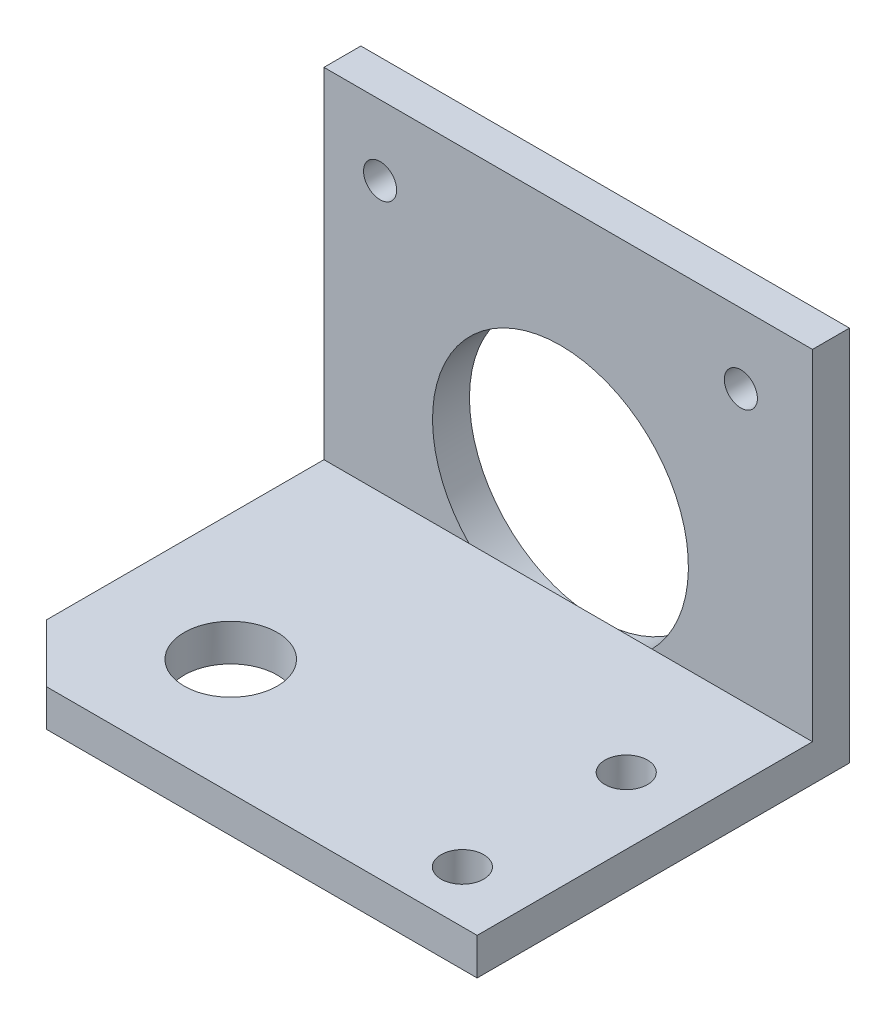
ISO-10303-21;
HEADER;
FILE_DESCRIPTION(('STEP AP214'),'2;1');
FILE_NAME('part.step','',(''),(''),'','','');
FILE_SCHEMA(('AUTOMOTIVE_DESIGN { 1 0 10303 214 1 1 1 1 }'));
ENDSEC;
DATA;
#1=APPLICATION_CONTEXT('core data for automotive mechanical design processes');
#2=APPLICATION_PROTOCOL_DEFINITION('international standard','automotive_design',2000,#1);
#3=PRODUCT_CONTEXT('',#1,'mechanical');
#4=PRODUCT('Part','Part','',(#3));
#5=PRODUCT_RELATED_PRODUCT_CATEGORY('part','',(#4));
#6=PRODUCT_DEFINITION_FORMATION('','',#4);
#7=PRODUCT_DEFINITION_CONTEXT('part definition',#1,'design');
#8=PRODUCT_DEFINITION('design','',#6,#7);
#9=PRODUCT_DEFINITION_SHAPE('','',#8);
#10=(LENGTH_UNIT() NAMED_UNIT(*) SI_UNIT(.MILLI.,.METRE.));
#11=(NAMED_UNIT(*) PLANE_ANGLE_UNIT() SI_UNIT($,.RADIAN.));
#12=(NAMED_UNIT(*) SI_UNIT($,.STERADIAN.) SOLID_ANGLE_UNIT());
#13=UNCERTAINTY_MEASURE_WITH_UNIT(LENGTH_MEASURE(1.E-05),#10,'distance_accuracy_value','');
#14=(GEOMETRIC_REPRESENTATION_CONTEXT(3) GLOBAL_UNCERTAINTY_ASSIGNED_CONTEXT((#13)) GLOBAL_UNIT_ASSIGNED_CONTEXT((#10,
#11,#12)) REPRESENTATION_CONTEXT('',''));
#15=CARTESIAN_POINT('',(0.,0.,0.));
#16=DIRECTION('',(0.,0.,1.));
#17=DIRECTION('',(1.,0.,0.));
#18=AXIS2_PLACEMENT_3D('',#15,#16,#17);
#19=CARTESIAN_POINT('',(21.,3.175,16.0020000000001));
#20=DIRECTION('',(-1.,0.,0.));
#21=DIRECTION('',(0.,0.,1.));
#22=AXIS2_PLACEMENT_3D('',#19,#20,#21);
#23=PLANE('',#22);
#24=DIRECTION('',(0.,0.,-1.));
#25=VECTOR('',#24,1.);
#26=CARTESIAN_POINT('',(21.,0.,16.0020000000001));
#27=LINE('',#26,#25);
#28=CARTESIAN_POINT('',(21.,0.,16.0020000000001));
#29=VERTEX_POINT('',#28);
#30=CARTESIAN_POINT('',(21.,0.,-16.0019999999999));
#31=VERTEX_POINT('',#30);
#32=EDGE_CURVE('E129',#29,#31,#27,.T.);
#33=ORIENTED_EDGE('',*,*,#32,.T.);
#34=DIRECTION('',(0.,-1.,0.));
#35=VECTOR('',#34,1.);
#36=CARTESIAN_POINT('',(21.,3.175,-16.0019999999999));
#37=LINE('',#36,#35);
#38=CARTESIAN_POINT('',(21.,32.385,-16.0019999999999));
#39=VERTEX_POINT('',#38);
#40=EDGE_CURVE('E144',#39,#31,#37,.T.);
#41=ORIENTED_EDGE('',*,*,#40,.F.);
#42=DIRECTION('',(0.,0.,-1.));
#43=VECTOR('',#42,1.);
#44=CARTESIAN_POINT('',(21.,32.385,-12.8269999999999));
#45=LINE('',#44,#43);
#46=CARTESIAN_POINT('',(21.,32.385,-12.8269999999999));
#47=VERTEX_POINT('',#46);
#48=EDGE_CURVE('E200',#47,#39,#45,.T.);
#49=ORIENTED_EDGE('',*,*,#48,.F.);
#50=DIRECTION('',(0.,-1.,0.));
#51=VECTOR('',#50,1.);
#52=CARTESIAN_POINT('',(21.,0.,-12.8269999999999));
#53=LINE('',#52,#51);
#54=CARTESIAN_POINT('',(21.,3.175,-12.8269999999999));
#55=VERTEX_POINT('',#54);
#56=EDGE_CURVE('E189',#47,#55,#53,.T.);
#57=ORIENTED_EDGE('',*,*,#56,.T.);
#58=DIRECTION('',(0.,0.,-1.));
#59=VECTOR('',#58,1.);
#60=CARTESIAN_POINT('',(21.,3.175,16.0020000000001));
#61=LINE('',#60,#59);
#62=CARTESIAN_POINT('',(21.,3.175,16.0020000000001));
#63=VERTEX_POINT('',#62);
#64=EDGE_CURVE('E130',#63,#55,#61,.T.);
#65=ORIENTED_EDGE('',*,*,#64,.F.);
#66=DIRECTION('',(0.,-1.,0.));
#67=VECTOR('',#66,1.);
#68=CARTESIAN_POINT('',(21.,3.175,16.0020000000001));
#69=LINE('',#68,#67);
#70=EDGE_CURVE('E139',#63,#29,#69,.T.);
#71=ORIENTED_EDGE('',*,*,#70,.T.);
#72=EDGE_LOOP('',(#33,#41,#49,#57,#65,#71));
#73=FACE_BOUND('',#72,.T.);
#74=ADVANCED_FACE('F32',(#73),#23,.F.);
#75=CARTESIAN_POINT('',(-20.9999999999999,3.175,-16.0019999999999));
#76=DIRECTION('',(0.,0.,1.));
#77=DIRECTION('',(1.,0.,0.));
#78=AXIS2_PLACEMENT_3D('',#75,#76,#77);
#79=PLANE('',#78);
#80=CARTESIAN_POINT('',(14.8407038267321,26.3651999999999,-16.0019999999999));
#81=DIRECTION('',(0.,0.,1.));
#82=DIRECTION('',(1.,0.,0.));
#83=AXIS2_PLACEMENT_3D('',#80,#81,#82);
#84=CIRCLE('',#83,1.4224);
#85=CARTESIAN_POINT('',(16.2631038267321,26.3651999999999,-16.0019999999999));
#86=VERTEX_POINT('',#85);
#87=EDGE_CURVE('E169',#86,#86,#84,.T.);
#88=ORIENTED_EDGE('',*,*,#87,.T.);
#89=EDGE_LOOP('',(#88));
#90=FACE_BOUND('',#89,.T.);
#91=CARTESIAN_POINT('',(-16.1726961732679,26.3652,-16.0019999999999));
#92=DIRECTION('',(0.,0.,1.));
#93=DIRECTION('',(1.,0.,0.));
#94=AXIS2_PLACEMENT_3D('',#91,#92,#93);
#95=CIRCLE('',#94,1.42239999999999);
#96=CARTESIAN_POINT('',(-14.7502961732679,26.3652,-16.0019999999999));
#97=VERTEX_POINT('',#96);
#98=EDGE_CURVE('E175',#97,#97,#95,.T.);
#99=ORIENTED_EDGE('',*,*,#98,.T.);
#100=EDGE_LOOP('',(#99));
#101=FACE_BOUND('',#100,.T.);
#102=DIRECTION('',(-1.,0.,0.));
#103=VECTOR('',#102,1.);
#104=CARTESIAN_POINT('',(-20.9999999999999,0.,-16.0019999999999));
#105=LINE('',#104,#103);
#106=CARTESIAN_POINT('',(1.08139645290411,0.,-16.0019999999999));
#107=VERTEX_POINT('',#106);
#108=EDGE_CURVE('E135',#31,#107,#105,.T.);
#109=ORIENTED_EDGE('',*,*,#108,.T.);
#110=CARTESIAN_POINT('',(-0.665996173267888,10.8585,-16.0019999999999));
#111=DIRECTION('',(0.,0.,1.));
#112=DIRECTION('',(1.,0.,0.));
#113=AXIS2_PLACEMENT_3D('',#110,#111,#112);
#114=CIRCLE('',#113,10.9982);
#115=CARTESIAN_POINT('',(-2.41338879943989,0.,-16.0019999999999));
#116=VERTEX_POINT('',#115);
#117=EDGE_CURVE('E183',#107,#116,#114,.T.);
#118=ORIENTED_EDGE('',*,*,#117,.T.);
#119=CARTESIAN_POINT('',(-20.9999999999999,0.,-16.0019999999999));
#120=VERTEX_POINT('',#119);
#121=EDGE_CURVE('E213',#116,#120,#105,.T.);
#122=ORIENTED_EDGE('',*,*,#121,.T.);
#123=DIRECTION('',(0.,-1.,0.));
#124=VECTOR('',#123,1.);
#125=CARTESIAN_POINT('',(-20.9999999999999,3.175,-16.0019999999999));
#126=LINE('',#125,#124);
#127=CARTESIAN_POINT('',(-20.9999999999999,32.385,-16.0019999999999));
#128=VERTEX_POINT('',#127);
#129=EDGE_CURVE('E141',#128,#120,#126,.T.);
#130=ORIENTED_EDGE('',*,*,#129,.F.);
#131=DIRECTION('',(1.,0.,0.));
#132=VECTOR('',#131,1.);
#133=CARTESIAN_POINT('',(21.,32.385,-16.0019999999999));
#134=LINE('',#133,#132);
#135=EDGE_CURVE('E188',#128,#39,#134,.T.);
#136=ORIENTED_EDGE('',*,*,#135,.T.);
#137=ORIENTED_EDGE('',*,*,#40,.T.);
#138=EDGE_LOOP('',(#109,#118,#122,#130,#136,#137));
#139=FACE_BOUND('',#138,.T.);
#140=ADVANCED_FACE('F217',(#90,#101,#139),#79,.F.);
#141=CARTESIAN_POINT('',(-20.9999999999999,3.175,16.0020000000001));
#142=DIRECTION('',(1.,0.,0.));
#143=DIRECTION('',(0.,0.,-1.));
#144=AXIS2_PLACEMENT_3D('',#141,#142,#143);
#145=PLANE('',#144);
#146=DIRECTION('',(0.,0.,1.));
#147=VECTOR('',#146,1.);
#148=CARTESIAN_POINT('',(-20.9999999999999,0.,16.0020000000001));
#149=LINE('',#148,#147);
#150=CARTESIAN_POINT('',(-20.9999999999999,0.,11.0172619347608));
#151=VERTEX_POINT('',#150);
#152=EDGE_CURVE('E131',#120,#151,#149,.T.);
#153=ORIENTED_EDGE('',*,*,#152,.T.);
#154=DIRECTION('',(0.,1.,0.));
#155=VECTOR('',#154,1.);
#156=CARTESIAN_POINT('',(-20.9999999999999,0.,11.0172619347608));
#157=LINE('',#156,#155);
#158=CARTESIAN_POINT('',(-20.9999999999999,3.175,11.0172619347608));
#159=VERTEX_POINT('',#158);
#160=EDGE_CURVE('E48',#151,#159,#157,.T.);
#161=ORIENTED_EDGE('',*,*,#160,.T.);
#162=DIRECTION('',(0.,0.,1.));
#163=VECTOR('',#162,1.);
#164=CARTESIAN_POINT('',(-20.9999999999999,3.175,16.0020000000001));
#165=LINE('',#164,#163);
#166=CARTESIAN_POINT('',(-20.9999999999999,3.175,-12.8269999999999));
#167=VERTEX_POINT('',#166);
#168=EDGE_CURVE('E133',#167,#159,#165,.T.);
#169=ORIENTED_EDGE('',*,*,#168,.F.);
#170=DIRECTION('',(0.,1.,0.));
#171=VECTOR('',#170,1.);
#172=CARTESIAN_POINT('',(-20.9999999999999,0.,-12.8269999999999));
#173=LINE('',#172,#171);
#174=CARTESIAN_POINT('',(-20.9999999999999,32.385,-12.8269999999999));
#175=VERTEX_POINT('',#174);
#176=EDGE_CURVE('E192',#167,#175,#173,.T.);
#177=ORIENTED_EDGE('',*,*,#176,.T.);
#178=DIRECTION('',(0.,0.,-1.));
#179=VECTOR('',#178,1.);
#180=CARTESIAN_POINT('',(-20.9999999999999,32.385,-12.8269999999999));
#181=LINE('',#180,#179);
#182=EDGE_CURVE('E197',#175,#128,#181,.T.);
#183=ORIENTED_EDGE('',*,*,#182,.T.);
#184=ORIENTED_EDGE('',*,*,#129,.T.);
#185=EDGE_LOOP('',(#153,#161,#169,#177,#183,#184));
#186=FACE_BOUND('',#185,.T.);
#187=ADVANCED_FACE('F220',(#186),#145,.F.);
#188=CARTESIAN_POINT('',(-20.9999999999999,3.175,16.0020000000001));
#189=DIRECTION('',(0.,0.,-1.));
#190=DIRECTION('',(-1.,0.,0.));
#191=AXIS2_PLACEMENT_3D('',#188,#189,#190);
#192=PLANE('',#191);
#193=DIRECTION('',(1.,0.,0.));
#194=VECTOR('',#193,1.);
#195=CARTESIAN_POINT('',(-20.9999999999999,3.175,16.0020000000001));
#196=LINE('',#195,#194);
#197=CARTESIAN_POINT('',(-16.0152619347606,3.175,16.0020000000001));
#198=VERTEX_POINT('',#197);
#199=EDGE_CURVE('E123',#198,#63,#196,.T.);
#200=ORIENTED_EDGE('',*,*,#199,.F.);
#201=DIRECTION('',(0.,1.,0.));
#202=VECTOR('',#201,1.);
#203=CARTESIAN_POINT('',(-16.0152619347606,0.,16.0020000000001));
#204=LINE('',#203,#202);
#205=CARTESIAN_POINT('',(-16.0152619347606,0.,16.0020000000001));
#206=VERTEX_POINT('',#205);
#207=EDGE_CURVE('E109',#206,#198,#204,.T.);
#208=ORIENTED_EDGE('',*,*,#207,.F.);
#209=DIRECTION('',(1.,0.,0.));
#210=VECTOR('',#209,1.);
#211=CARTESIAN_POINT('',(-20.9999999999999,0.,16.0020000000001));
#212=LINE('',#211,#210);
#213=EDGE_CURVE('E121',#206,#29,#212,.T.);
#214=ORIENTED_EDGE('',*,*,#213,.T.);
#215=ORIENTED_EDGE('',*,*,#70,.F.);
#216=EDGE_LOOP('',(#200,#208,#214,#215));
#217=FACE_BOUND('',#216,.T.);
#218=ADVANCED_FACE('F119',(#217),#192,.F.);
#219=CARTESIAN_POINT('',(0.,3.175,0.));
#220=DIRECTION('',(0.,-1.,0.));
#221=DIRECTION('',(0.,0.,-1.));
#222=AXIS2_PLACEMENT_3D('',#219,#220,#221);
#223=PLANE('',#222);
#224=CARTESIAN_POINT('',(15.2705129297045,3.175,-2.54563917507482));
#225=DIRECTION('',(0.,1.,0.));
#226=DIRECTION('',(0.,0.,1.));
#227=AXIS2_PLACEMENT_3D('',#224,#225,#226);
#228=CIRCLE('',#227,1.82880000000001);
#229=CARTESIAN_POINT('',(15.2705129297045,3.175,-0.716839175074805));
#230=VERTEX_POINT('',#229);
#231=EDGE_CURVE('E164',#230,#230,#228,.T.);
#232=ORIENTED_EDGE('',*,*,#231,.F.);
#233=EDGE_LOOP('',(#232));
#234=FACE_BOUND('',#233,.T.);
#235=CARTESIAN_POINT('',(15.2705129297045,3.175,11.5410443722919));
#236=DIRECTION('',(0.,1.,0.));
#237=DIRECTION('',(0.,0.,1.));
#238=AXIS2_PLACEMENT_3D('',#235,#236,#237);
#239=CIRCLE('',#238,1.82879999999999);
#240=CARTESIAN_POINT('',(15.2705129297045,3.175,13.3698443722919));
#241=VERTEX_POINT('',#240);
#242=EDGE_CURVE('E154',#241,#241,#239,.T.);
#243=ORIENTED_EDGE('',*,*,#242,.F.);
#244=EDGE_LOOP('',(#243));
#245=FACE_BOUND('',#244,.T.);
#246=CARTESIAN_POINT('',(-10.1464872902955,3.175,6.03813754511478));
#247=DIRECTION('',(0.,1.,0.));
#248=DIRECTION('',(0.,0.,1.));
#249=AXIS2_PLACEMENT_3D('',#246,#247,#248);
#250=CIRCLE('',#249,4.00049999999999);
#251=CARTESIAN_POINT('',(-10.1464872902955,3.175,10.0386375451148));
#252=VERTEX_POINT('',#251);
#253=EDGE_CURVE('E151',#252,#252,#250,.T.);
#254=ORIENTED_EDGE('',*,*,#253,.F.);
#255=EDGE_LOOP('',(#254));
#256=FACE_BOUND('',#255,.T.);
#257=ORIENTED_EDGE('',*,*,#168,.T.);
#258=DIRECTION('',(-0.707106781186548,0.,-0.707106781186548));
#259=VECTOR('',#258,1.);
#260=CARTESIAN_POINT('',(-16.0152619347606,3.175,16.0020000000001));
#261=LINE('',#260,#259);
#262=EDGE_CURVE('E115',#198,#159,#261,.T.);
#263=ORIENTED_EDGE('',*,*,#262,.F.);
#264=ORIENTED_EDGE('',*,*,#199,.T.);
#265=ORIENTED_EDGE('',*,*,#64,.T.);
#266=DIRECTION('',(-1.,0.,0.));
#267=VECTOR('',#266,1.);
#268=CARTESIAN_POINT('',(0.,3.175,-12.8269999999999));
#269=LINE('',#268,#267);
#270=CARTESIAN_POINT('',(7.20319889293807,3.175,-12.8269999999999));
#271=VERTEX_POINT('',#270);
#272=EDGE_CURVE('E206',#55,#271,#269,.T.);
#273=ORIENTED_EDGE('',*,*,#272,.T.);
#274=CARTESIAN_POINT('',(-8.53519123947385,3.175,-12.8269999999999));
#275=VERTEX_POINT('',#274);
#276=EDGE_CURVE('E208',#271,#275,#269,.T.);
#277=ORIENTED_EDGE('',*,*,#276,.T.);
#278=EDGE_CURVE('E203',#275,#167,#269,.T.);
#279=ORIENTED_EDGE('',*,*,#278,.T.);
#280=EDGE_LOOP('',(#257,#263,#264,#265,#273,#277,#279));
#281=FACE_BOUND('',#280,.T.);
#282=ADVANCED_FACE('F244',(#234,#245,#256,#281),#223,.F.);
#283=CARTESIAN_POINT('',(0.,0.,0.));
#284=DIRECTION('',(0.,-1.,0.));
#285=DIRECTION('',(0.,0.,-1.));
#286=AXIS2_PLACEMENT_3D('',#283,#284,#285);
#287=PLANE('',#286);
#288=DIRECTION('',(-0.707106781186548,0.,-0.707106781186548));
#289=VECTOR('',#288,1.);
#290=CARTESIAN_POINT('',(-16.0152619347606,0.,16.0020000000001));
#291=LINE('',#290,#289);
#292=EDGE_CURVE('E106',#206,#151,#291,.T.);
#293=ORIENTED_EDGE('',*,*,#292,.T.);
#294=ORIENTED_EDGE('',*,*,#152,.F.);
#295=ORIENTED_EDGE('',*,*,#121,.F.);
#296=DIRECTION('',(0.,0.,1.));
#297=VECTOR('',#296,1.);
#298=CARTESIAN_POINT('',(-2.41338879943989,0.,-17.9069999999999));
#299=LINE('',#298,#297);
#300=CARTESIAN_POINT('',(-2.41338879943989,0.,-12.8269999999999));
#301=VERTEX_POINT('',#300);
#302=EDGE_CURVE('E181',#301,#116,#299,.F.);
#303=ORIENTED_EDGE('',*,*,#302,.F.);
#304=DIRECTION('',(-1.,0.,0.));
#305=VECTOR('',#304,1.);
#306=CARTESIAN_POINT('',(0.,0.,-12.8269999999999));
#307=LINE('',#306,#305);
#308=CARTESIAN_POINT('',(1.08139645290411,0.,-12.8269999999999));
#309=VERTEX_POINT('',#308);
#310=EDGE_CURVE('E11',#309,#301,#307,.T.);
#311=ORIENTED_EDGE('',*,*,#310,.F.);
#312=DIRECTION('',(0.,0.,1.));
#313=VECTOR('',#312,1.);
#314=CARTESIAN_POINT('',(1.08139645290411,0.,-17.9069999999999));
#315=LINE('',#314,#313);
#316=EDGE_CURVE('E186',#107,#309,#315,.T.);
#317=ORIENTED_EDGE('',*,*,#316,.F.);
#318=ORIENTED_EDGE('',*,*,#108,.F.);
#319=ORIENTED_EDGE('',*,*,#32,.F.);
#320=ORIENTED_EDGE('',*,*,#213,.F.);
#321=EDGE_LOOP('',(#293,#294,#295,#303,#311,#317,#318,#319,#320));
#322=FACE_BOUND('',#321,.T.);
#323=CARTESIAN_POINT('',(15.2705129297045,0.,-2.54563917507482));
#324=DIRECTION('',(0.,-1.,0.));
#325=DIRECTION('',(0.,0.,-1.));
#326=AXIS2_PLACEMENT_3D('',#323,#324,#325);
#327=CIRCLE('',#326,1.82880000000001);
#328=CARTESIAN_POINT('',(15.2705129297045,0.,-4.37443917507483));
#329=VERTEX_POINT('',#328);
#330=EDGE_CURVE('E35',#329,#329,#327,.T.);
#331=ORIENTED_EDGE('',*,*,#330,.F.);
#332=EDGE_LOOP('',(#331));
#333=FACE_BOUND('',#332,.T.);
#334=CARTESIAN_POINT('',(15.2705129297045,0.,11.5410443722919));
#335=DIRECTION('',(0.,-1.,0.));
#336=DIRECTION('',(0.,0.,-1.));
#337=AXIS2_PLACEMENT_3D('',#334,#335,#336);
#338=CIRCLE('',#337,1.82879999999999);
#339=CARTESIAN_POINT('',(15.2705129297045,0.,9.71224437229189));
#340=VERTEX_POINT('',#339);
#341=EDGE_CURVE('E152',#340,#340,#338,.T.);
#342=ORIENTED_EDGE('',*,*,#341,.F.);
#343=EDGE_LOOP('',(#342));
#344=FACE_BOUND('',#343,.T.);
#345=CARTESIAN_POINT('',(-10.1464872902955,0.,6.03813754511478));
#346=DIRECTION('',(0.,-1.,0.));
#347=DIRECTION('',(0.,0.,-1.));
#348=AXIS2_PLACEMENT_3D('',#345,#346,#347);
#349=CIRCLE('',#348,4.00049999999999);
#350=CARTESIAN_POINT('',(-10.1464872902955,0.,2.03763754511479));
#351=VERTEX_POINT('',#350);
#352=EDGE_CURVE('E148',#351,#351,#349,.T.);
#353=ORIENTED_EDGE('',*,*,#352,.F.);
#354=EDGE_LOOP('',(#353));
#355=FACE_BOUND('',#354,.T.);
#356=ADVANCED_FACE('F126',(#322,#333,#344,#355),#287,.T.);
#357=CARTESIAN_POINT('',(0.,0.,-12.8269999999999));
#358=DIRECTION('',(0.,0.,1.));
#359=DIRECTION('',(1.,0.,0.));
#360=AXIS2_PLACEMENT_3D('',#357,#358,#359);
#361=PLANE('',#360);
#362=CARTESIAN_POINT('',(14.8407038267321,26.3651999999999,-12.8269999999999));
#363=DIRECTION('',(0.,0.,1.));
#364=DIRECTION('',(1.,0.,0.));
#365=AXIS2_PLACEMENT_3D('',#362,#363,#364);
#366=CIRCLE('',#365,1.4224);
#367=CARTESIAN_POINT('',(16.2631038267321,26.3651999999999,-12.8269999999999));
#368=VERTEX_POINT('',#367);
#369=EDGE_CURVE('E150',#368,#368,#366,.T.);
#370=ORIENTED_EDGE('',*,*,#369,.F.);
#371=EDGE_LOOP('',(#370));
#372=FACE_BOUND('',#371,.T.);
#373=CARTESIAN_POINT('',(-16.1726961732679,26.3652,-12.8269999999999));
#374=DIRECTION('',(0.,0.,1.));
#375=DIRECTION('',(1.,0.,0.));
#376=AXIS2_PLACEMENT_3D('',#373,#374,#375);
#377=CIRCLE('',#376,1.42239999999999);
#378=CARTESIAN_POINT('',(-14.7502961732679,26.3652,-12.8269999999999));
#379=VERTEX_POINT('',#378);
#380=EDGE_CURVE('E172',#379,#379,#377,.T.);
#381=ORIENTED_EDGE('',*,*,#380,.F.);
#382=EDGE_LOOP('',(#381));
#383=FACE_BOUND('',#382,.T.);
#384=CARTESIAN_POINT('',(-0.665996173267888,10.8585,-12.8269999999999));
#385=DIRECTION('',(0.,0.,1.));
#386=DIRECTION('',(1.,0.,0.));
#387=AXIS2_PLACEMENT_3D('',#384,#385,#386);
#388=CIRCLE('',#387,10.9982);
#389=EDGE_CURVE('E40',#271,#275,#388,.T.);
#390=ORIENTED_EDGE('',*,*,#389,.F.);
#391=ORIENTED_EDGE('',*,*,#272,.F.);
#392=ORIENTED_EDGE('',*,*,#56,.F.);
#393=DIRECTION('',(1.,0.,0.));
#394=VECTOR('',#393,1.);
#395=CARTESIAN_POINT('',(21.,32.385,-12.8269999999999));
#396=LINE('',#395,#394);
#397=EDGE_CURVE('E194',#175,#47,#396,.T.);
#398=ORIENTED_EDGE('',*,*,#397,.F.);
#399=ORIENTED_EDGE('',*,*,#176,.F.);
#400=ORIENTED_EDGE('',*,*,#278,.F.);
#401=EDGE_LOOP('',(#390,#391,#392,#398,#399,#400));
#402=FACE_BOUND('',#401,.T.);
#403=ADVANCED_FACE('F241',(#372,#383,#402),#361,.T.);
#404=CARTESIAN_POINT('',(21.,32.385,-12.8269999999999));
#405=DIRECTION('',(0.,1.,0.));
#406=DIRECTION('',(0.,0.,1.));
#407=AXIS2_PLACEMENT_3D('',#404,#405,#406);
#408=PLANE('',#407);
#409=ORIENTED_EDGE('',*,*,#135,.F.);
#410=ORIENTED_EDGE('',*,*,#182,.F.);
#411=ORIENTED_EDGE('',*,*,#397,.T.);
#412=ORIENTED_EDGE('',*,*,#48,.T.);
#413=EDGE_LOOP('',(#409,#410,#411,#412));
#414=FACE_BOUND('',#413,.T.);
#415=ADVANCED_FACE('F227',(#414),#408,.T.);
#416=CARTESIAN_POINT('',(-0.665996173267888,10.8585,-12.8269999999999));
#417=DIRECTION('',(0.,0.,1.));
#418=DIRECTION('',(1.,0.,0.));
#419=AXIS2_PLACEMENT_3D('',#416,#417,#418);
#420=PLANE('',#419);
#421=CARTESIAN_POINT('',(-0.665996173267888,10.8585,-12.8269999999999));
#422=DIRECTION('',(0.,0.,1.));
#423=DIRECTION('',(1.,0.,0.));
#424=AXIS2_PLACEMENT_3D('',#421,#422,#423);
#425=CIRCLE('',#424,10.9982);
#426=EDGE_CURVE('E55',#309,#271,#425,.T.);
#427=ORIENTED_EDGE('',*,*,#426,.F.);
#428=ORIENTED_EDGE('',*,*,#310,.T.);
#429=EDGE_CURVE('E178',#275,#301,#425,.T.);
#430=ORIENTED_EDGE('',*,*,#429,.F.);
#431=ORIENTED_EDGE('',*,*,#276,.F.);
#432=EDGE_LOOP('',(#427,#428,#430,#431));
#433=FACE_BOUND('',#432,.T.);
#434=ADVANCED_FACE('F238',(#433),#420,.F.);
#435=CARTESIAN_POINT('',(-0.665996173267888,10.8585,-17.9069999999999));
#436=DIRECTION('',(0.,0.,1.));
#437=DIRECTION('',(1.,0.,0.));
#438=AXIS2_PLACEMENT_3D('',#435,#436,#437);
#439=CYLINDRICAL_SURFACE('',#438,10.9982);
#440=ORIENTED_EDGE('',*,*,#316,.T.);
#441=ORIENTED_EDGE('',*,*,#426,.T.);
#442=ORIENTED_EDGE('',*,*,#389,.T.);
#443=ORIENTED_EDGE('',*,*,#429,.T.);
#444=ORIENTED_EDGE('',*,*,#302,.T.);
#445=ORIENTED_EDGE('',*,*,#117,.F.);
#446=EDGE_LOOP('',(#440,#441,#442,#443,#444,#445));
#447=FACE_BOUND('',#446,.T.);
#448=ADVANCED_FACE('F234',(#447),#439,.F.);
#449=CARTESIAN_POINT('',(-16.1726961732679,26.3652,-17.9069999999999));
#450=DIRECTION('',(0.,0.,1.));
#451=DIRECTION('',(1.,0.,0.));
#452=AXIS2_PLACEMENT_3D('',#449,#450,#451);
#453=CYLINDRICAL_SURFACE('',#452,1.42239999999999);
#454=ORIENTED_EDGE('',*,*,#380,.T.);
#455=EDGE_LOOP('',(#454));
#456=FACE_BOUND('',#455,.T.);
#457=ORIENTED_EDGE('',*,*,#98,.F.);
#458=EDGE_LOOP('',(#457));
#459=FACE_BOUND('',#458,.T.);
#460=ADVANCED_FACE('F269',(#456,#459),#453,.F.);
#461=CARTESIAN_POINT('',(14.8407038267321,26.3651999999999,-17.9069999999999));
#462=DIRECTION('',(0.,0.,1.));
#463=DIRECTION('',(1.,0.,0.));
#464=AXIS2_PLACEMENT_3D('',#461,#462,#463);
#465=CYLINDRICAL_SURFACE('',#464,1.4224);
#466=ORIENTED_EDGE('',*,*,#369,.T.);
#467=EDGE_LOOP('',(#466));
#468=FACE_BOUND('',#467,.T.);
#469=ORIENTED_EDGE('',*,*,#87,.F.);
#470=EDGE_LOOP('',(#469));
#471=FACE_BOUND('',#470,.T.);
#472=ADVANCED_FACE('F261',(#468,#471),#465,.F.);
#473=CARTESIAN_POINT('',(-10.1464872902955,-1.9304,6.03813754511478));
#474=DIRECTION('',(0.,1.,0.));
#475=DIRECTION('',(0.,0.,1.));
#476=AXIS2_PLACEMENT_3D('',#473,#474,#475);
#477=CYLINDRICAL_SURFACE('',#476,4.00049999999999);
#478=ORIENTED_EDGE('',*,*,#352,.T.);
#479=EDGE_LOOP('',(#478));
#480=FACE_BOUND('',#479,.T.);
#481=ORIENTED_EDGE('',*,*,#253,.T.);
#482=EDGE_LOOP('',(#481));
#483=FACE_BOUND('',#482,.T.);
#484=ADVANCED_FACE('F258',(#480,#483),#477,.F.);
#485=CARTESIAN_POINT('',(15.2705129297045,-1.9304,11.5410443722919));
#486=DIRECTION('',(0.,1.,0.));
#487=DIRECTION('',(0.,0.,1.));
#488=AXIS2_PLACEMENT_3D('',#485,#486,#487);
#489=CYLINDRICAL_SURFACE('',#488,1.82879999999999);
#490=ORIENTED_EDGE('',*,*,#341,.T.);
#491=EDGE_LOOP('',(#490));
#492=FACE_BOUND('',#491,.T.);
#493=ORIENTED_EDGE('',*,*,#242,.T.);
#494=EDGE_LOOP('',(#493));
#495=FACE_BOUND('',#494,.T.);
#496=ADVANCED_FACE('F260',(#492,#495),#489,.F.);
#497=CARTESIAN_POINT('',(15.2705129297045,-1.9304,-2.54563917507482));
#498=DIRECTION('',(0.,1.,0.));
#499=DIRECTION('',(0.,0.,1.));
#500=AXIS2_PLACEMENT_3D('',#497,#498,#499);
#501=CYLINDRICAL_SURFACE('',#500,1.82880000000001);
#502=ORIENTED_EDGE('',*,*,#330,.T.);
#503=EDGE_LOOP('',(#502));
#504=FACE_BOUND('',#503,.T.);
#505=ORIENTED_EDGE('',*,*,#231,.T.);
#506=EDGE_LOOP('',(#505));
#507=FACE_BOUND('',#506,.T.);
#508=ADVANCED_FACE('F250',(#504,#507),#501,.F.);
#509=CARTESIAN_POINT('',(-16.0152619347606,0.,16.0020000000001));
#510=DIRECTION('',(0.707106781186548,0.,-0.707106781186548));
#511=DIRECTION('',(-0.707106781186548,0.,-0.707106781186548));
#512=AXIS2_PLACEMENT_3D('',#509,#510,#511);
#513=PLANE('',#512);
#514=ORIENTED_EDGE('',*,*,#262,.T.);
#515=ORIENTED_EDGE('',*,*,#160,.F.);
#516=ORIENTED_EDGE('',*,*,#292,.F.);
#517=ORIENTED_EDGE('',*,*,#207,.T.);
#518=EDGE_LOOP('',(#514,#515,#516,#517));
#519=FACE_BOUND('',#518,.T.);
#520=ADVANCED_FACE('F108',(#519),#513,.F.);
#521=CLOSED_SHELL('',(#74,#140,#187,#218,#282,#356,#403,#415,#434,#448,#460,#472,#484,#496,#508,#520));
#522=MANIFOLD_SOLID_BREP('B2',#521);
#523=ADVANCED_BREP_SHAPE_REPRESENTATION('',(#18,#522),#14);
#524=SHAPE_DEFINITION_REPRESENTATION(#9,#523);
ENDSEC;
END-ISO-10303-21;
